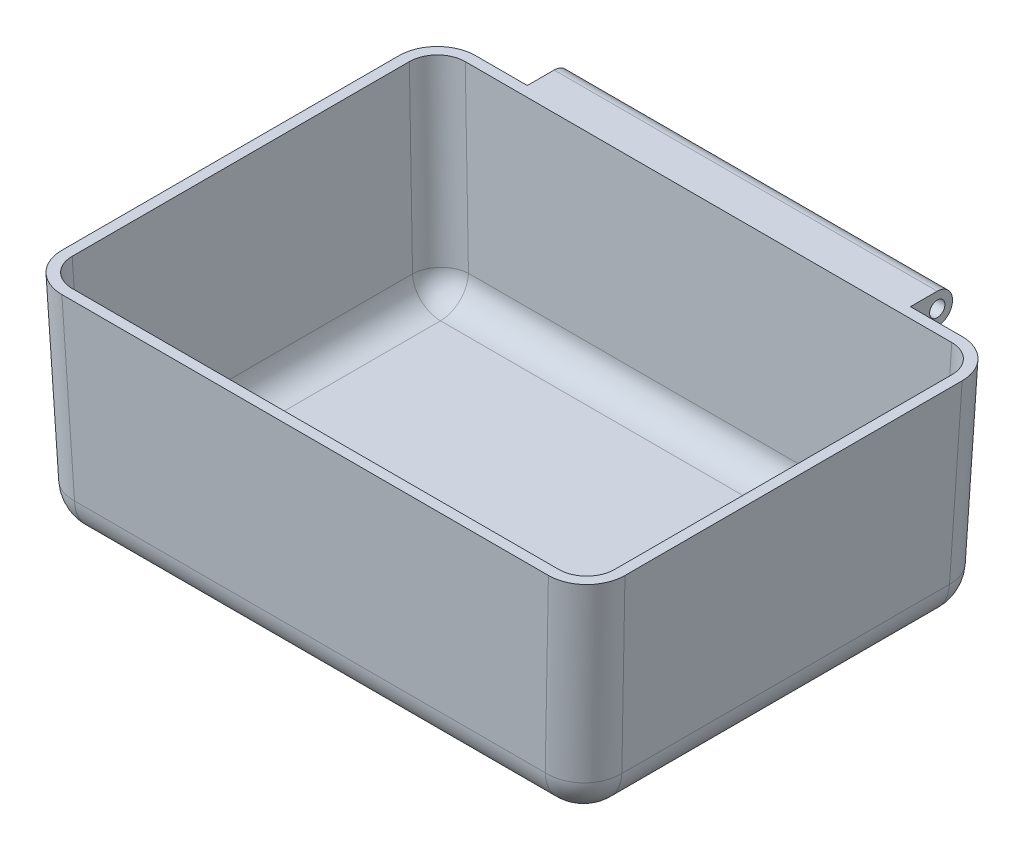
ISO-10303-21;
HEADER;
FILE_DESCRIPTION(('STEP AP214'),'2;1');
FILE_NAME('part.step','',(''),(''),'','','');
FILE_SCHEMA(('AUTOMOTIVE_DESIGN { 1 0 10303 214 1 1 1 1 }'));
ENDSEC;
DATA;
#1=APPLICATION_CONTEXT('core data for automotive mechanical design processes');
#2=APPLICATION_PROTOCOL_DEFINITION('international standard','automotive_design',2000,#1);
#3=PRODUCT_CONTEXT('',#1,'mechanical');
#4=PRODUCT('Part','Part','',(#3));
#5=PRODUCT_RELATED_PRODUCT_CATEGORY('part','',(#4));
#6=PRODUCT_DEFINITION_FORMATION('','',#4);
#7=PRODUCT_DEFINITION_CONTEXT('part definition',#1,'design');
#8=PRODUCT_DEFINITION('design','',#6,#7);
#9=PRODUCT_DEFINITION_SHAPE('','',#8);
#10=(LENGTH_UNIT() NAMED_UNIT(*) SI_UNIT(.MILLI.,.METRE.));
#11=(NAMED_UNIT(*) PLANE_ANGLE_UNIT() SI_UNIT($,.RADIAN.));
#12=(NAMED_UNIT(*) SI_UNIT($,.STERADIAN.) SOLID_ANGLE_UNIT());
#13=UNCERTAINTY_MEASURE_WITH_UNIT(LENGTH_MEASURE(1.E-05),#10,'distance_accuracy_value','');
#14=(GEOMETRIC_REPRESENTATION_CONTEXT(3) GLOBAL_UNCERTAINTY_ASSIGNED_CONTEXT((#13)) GLOBAL_UNIT_ASSIGNED_CONTEXT((#10,
#11,#12)) REPRESENTATION_CONTEXT('',''));
#15=CARTESIAN_POINT('',(0.,0.,0.));
#16=DIRECTION('',(0.,0.,1.));
#17=DIRECTION('',(1.,0.,0.));
#18=AXIS2_PLACEMENT_3D('',#15,#16,#17);
#19=CARTESIAN_POINT('',(0.,0.,0.));
#20=DIRECTION('',(0.,1.,0.));
#21=DIRECTION('',(0.,0.,1.));
#22=AXIS2_PLACEMENT_3D('',#19,#20,#21);
#23=PLANE('',#22);
#24=DIRECTION('',(0.,0.,1.));
#25=VECTOR('',#24,1.);
#26=CARTESIAN_POINT('',(-61.4364686080028,0.,-52.5));
#27=LINE('',#26,#25);
#28=CARTESIAN_POINT('',(-61.4364686080028,0.,42.7642704136395));
#29=VERTEX_POINT('',#28);
#30=CARTESIAN_POINT('',(-61.4364686080028,0.,-42.7642704136395));
#31=VERTEX_POINT('',#30);
#32=EDGE_CURVE('E477',#29,#31,#27,.F.);
#33=ORIENTED_EDGE('',*,*,#32,.T.);
#34=DIRECTION('',(-1.,0.,0.));
#35=VECTOR('',#34,1.);
#36=CARTESIAN_POINT('',(71.,0.,-42.7642704136395));
#37=LINE('',#36,#35);
#38=CARTESIAN_POINT('',(61.4364686080027,0.,-42.7642704136395));
#39=VERTEX_POINT('',#38);
#40=EDGE_CURVE('E443',#31,#39,#37,.F.);
#41=ORIENTED_EDGE('',*,*,#40,.T.);
#42=DIRECTION('',(0.,0.,-1.));
#43=VECTOR('',#42,1.);
#44=CARTESIAN_POINT('',(61.4364686080027,0.,52.5));
#45=LINE('',#44,#43);
#46=CARTESIAN_POINT('',(61.4364686080027,0.,42.7642704136395));
#47=VERTEX_POINT('',#46);
#48=EDGE_CURVE('E543',#39,#47,#45,.F.);
#49=ORIENTED_EDGE('',*,*,#48,.T.);
#50=DIRECTION('',(1.,0.,0.));
#51=VECTOR('',#50,1.);
#52=CARTESIAN_POINT('',(-71.,0.,42.7642704136395));
#53=LINE('',#52,#51);
#54=EDGE_CURVE('E547',#47,#29,#53,.F.);
#55=ORIENTED_EDGE('',*,*,#54,.T.);
#56=EDGE_LOOP('',(#33,#41,#49,#55));
#57=FACE_BOUND('',#56,.T.);
#58=ADVANCED_FACE('F48',(#57),#23,.F.);
#59=CARTESIAN_POINT('',(0.,56.,0.));
#60=DIRECTION('',(0.,1.,0.));
#61=DIRECTION('',(0.,0.,1.));
#62=AXIS2_PLACEMENT_3D('',#59,#60,#61);
#63=PLANE('',#62);
#64=DIRECTION('',(0.,0.,1.));
#65=VECTOR('',#64,1.);
#66=CARTESIAN_POINT('',(-70.7973108098751,56.,0.));
#67=LINE('',#66,#65);
#68=CARTESIAN_POINT('',(-70.7973108098751,56.,-44.0051338580685));
#69=VERTEX_POINT('',#68);
#70=CARTESIAN_POINT('',(-70.7973108098751,56.,44.0051338580685));
#71=VERTEX_POINT('',#70);
#72=EDGE_CURVE('E318',#69,#71,#67,.T.);
#73=ORIENTED_EDGE('',*,*,#72,.F.);
#74=CARTESIAN_POINT('',(-63.4900400365742,56.,-43.9964132707823));
#75=DIRECTION('',(0.,1.,0.));
#76=DIRECTION('',(0.857492925712545,0.,0.514495755427525));
#77=AXIS2_PLACEMENT_3D('',#74,#75,#76);
#78=ELLIPSE('',#77,7.30988648132773,7.3);
#79=CARTESIAN_POINT('',(-63.4987661797022,56.,-51.2990315831112));
#80=VERTEX_POINT('',#79);
#81=EDGE_CURVE('E324',#80,#69,#78,.T.);
#82=ORIENTED_EDGE('',*,*,#81,.F.);
#83=DIRECTION('',(-1.,0.,0.));
#84=VECTOR('',#83,1.);
#85=CARTESIAN_POINT('',(0.,56.,-51.2990315831112));
#86=LINE('',#85,#84);
#87=CARTESIAN_POINT('',(63.4987661797021,56.,-51.2990315831112));
#88=VERTEX_POINT('',#87);
#89=EDGE_CURVE('E74',#88,#80,#86,.T.);
#90=ORIENTED_EDGE('',*,*,#89,.F.);
#91=CARTESIAN_POINT('',(63.4900400365742,56.,-43.9964132707823));
#92=DIRECTION('',(0.,1.,0.));
#93=DIRECTION('',(-0.857492925712548,0.,0.514495755427521));
#94=AXIS2_PLACEMENT_3D('',#91,#92,#93);
#95=ELLIPSE('',#94,7.30988648132773,7.3);
#96=CARTESIAN_POINT('',(70.797310809875,56.,-44.0051338580685));
#97=VERTEX_POINT('',#96);
#98=EDGE_CURVE('E320',#97,#88,#95,.T.);
#99=ORIENTED_EDGE('',*,*,#98,.F.);
#100=DIRECTION('',(0.,0.,-1.));
#101=VECTOR('',#100,1.);
#102=CARTESIAN_POINT('',(70.797310809875,56.,0.));
#103=LINE('',#102,#101);
#104=CARTESIAN_POINT('',(70.797310809875,56.,44.0051338580685));
#105=VERTEX_POINT('',#104);
#106=EDGE_CURVE('E259',#105,#97,#103,.T.);
#107=ORIENTED_EDGE('',*,*,#106,.F.);
#108=CARTESIAN_POINT('',(63.4900400365742,56.,43.9964132707824));
#109=DIRECTION('',(0.,1.,0.));
#110=DIRECTION('',(-0.857492925712546,0.,-0.514495755427524));
#111=AXIS2_PLACEMENT_3D('',#108,#109,#110);
#112=ELLIPSE('',#111,7.30988648132773,7.3);
#113=CARTESIAN_POINT('',(63.4987661797021,56.,51.2990315831113));
#114=VERTEX_POINT('',#113);
#115=EDGE_CURVE('E281',#114,#105,#112,.T.);
#116=ORIENTED_EDGE('',*,*,#115,.F.);
#117=DIRECTION('',(1.,0.,0.));
#118=VECTOR('',#117,1.);
#119=CARTESIAN_POINT('',(0.,56.,51.2990315831113));
#120=LINE('',#119,#118);
#121=CARTESIAN_POINT('',(-63.4987661797021,56.,51.2990315831113));
#122=VERTEX_POINT('',#121);
#123=EDGE_CURVE('E315',#122,#114,#120,.T.);
#124=ORIENTED_EDGE('',*,*,#123,.F.);
#125=CARTESIAN_POINT('',(-63.4900400365742,56.,43.9964132707824));
#126=DIRECTION('',(0.,1.,0.));
#127=DIRECTION('',(0.857492925712543,0.,-0.514495755427528));
#128=AXIS2_PLACEMENT_3D('',#125,#126,#127);
#129=ELLIPSE('',#128,7.30988648132773,7.3);
#130=EDGE_CURVE('E327',#71,#122,#129,.T.);
#131=ORIENTED_EDGE('',*,*,#130,.F.);
#132=EDGE_LOOP('',(#73,#82,#90,#99,#107,#116,#124,#131));
#133=FACE_BOUND('',#132,.T.);
#134=DIRECTION('',(0.,0.,1.));
#135=VECTOR('',#134,1.);
#136=CARTESIAN_POINT('',(-73.5,56.,-54.));
#137=LINE('',#136,#135);
#138=CARTESIAN_POINT('',(-73.5,56.,-44.0083592807634));
#139=VERTEX_POINT('',#138);
#140=CARTESIAN_POINT('',(-73.5,56.,44.0083592807634));
#141=VERTEX_POINT('',#140);
#142=EDGE_CURVE('E441',#139,#141,#137,.T.);
#143=ORIENTED_EDGE('',*,*,#142,.T.);
#144=CARTESIAN_POINT('',(-63.4900400365742,56.,43.9964132707824));
#145=DIRECTION('',(0.,1.,0.));
#146=DIRECTION('',(0.857492925712543,0.,-0.514495755427528));
#147=AXIS2_PLACEMENT_3D('',#144,#145,#146);
#148=ELLIPSE('',#147,10.0135431251065,10.);
#149=CARTESIAN_POINT('',(-63.5019936572974,56.,54.));
#150=VERTEX_POINT('',#149);
#151=EDGE_CURVE('E12',#141,#150,#148,.T.);
#152=ORIENTED_EDGE('',*,*,#151,.T.);
#153=DIRECTION('',(1.,0.,0.));
#154=VECTOR('',#153,1.);
#155=CARTESIAN_POINT('',(-73.5,56.,54.));
#156=LINE('',#155,#154);
#157=CARTESIAN_POINT('',(63.5019936572974,56.,54.));
#158=VERTEX_POINT('',#157);
#159=EDGE_CURVE('E376',#150,#158,#156,.T.);
#160=ORIENTED_EDGE('',*,*,#159,.T.);
#161=CARTESIAN_POINT('',(63.4900400365742,56.,43.9964132707824));
#162=DIRECTION('',(0.,1.,0.));
#163=DIRECTION('',(-0.857492925712546,0.,-0.514495755427524));
#164=AXIS2_PLACEMENT_3D('',#161,#162,#163);
#165=ELLIPSE('',#164,10.0135431251065,10.);
#166=CARTESIAN_POINT('',(73.5,56.,44.0083592807634));
#167=VERTEX_POINT('',#166);
#168=EDGE_CURVE('E578',#158,#167,#165,.T.);
#169=ORIENTED_EDGE('',*,*,#168,.T.);
#170=DIRECTION('',(0.,0.,-1.));
#171=VECTOR('',#170,1.);
#172=CARTESIAN_POINT('',(73.5,56.,-54.));
#173=LINE('',#172,#171);
#174=CARTESIAN_POINT('',(73.5,56.,-44.0083592807634));
#175=VERTEX_POINT('',#174);
#176=EDGE_CURVE('E397',#167,#175,#173,.T.);
#177=ORIENTED_EDGE('',*,*,#176,.T.);
#178=CARTESIAN_POINT('',(63.4900400365742,56.,-43.9964132707823));
#179=DIRECTION('',(0.,1.,0.));
#180=DIRECTION('',(-0.857492925712548,0.,0.514495755427521));
#181=AXIS2_PLACEMENT_3D('',#178,#179,#180);
#182=ELLIPSE('',#181,10.0135431251065,10.);
#183=CARTESIAN_POINT('',(63.5019936572974,56.,-54.));
#184=VERTEX_POINT('',#183);
#185=EDGE_CURVE('E525',#175,#184,#182,.T.);
#186=ORIENTED_EDGE('',*,*,#185,.T.);
#187=DIRECTION('',(-1.,0.,0.));
#188=VECTOR('',#187,1.);
#189=CARTESIAN_POINT('',(-73.5,56.,-54.));
#190=LINE('',#189,#188);
#191=CARTESIAN_POINT('',(50.,56.,-54.));
#192=VERTEX_POINT('',#191);
#193=EDGE_CURVE('E502',#184,#192,#190,.T.);
#194=ORIENTED_EDGE('',*,*,#193,.T.);
#195=DIRECTION('',(0.,0.,1.));
#196=VECTOR('',#195,1.);
#197=CARTESIAN_POINT('',(50.,56.,-54.));
#198=LINE('',#197,#196);
#199=CARTESIAN_POINT('',(50.,56.,-61.));
#200=VERTEX_POINT('',#199);
#201=EDGE_CURVE('E66',#200,#192,#198,.T.);
#202=ORIENTED_EDGE('',*,*,#201,.F.);
#203=DIRECTION('',(1.,0.,0.));
#204=VECTOR('',#203,1.);
#205=CARTESIAN_POINT('',(-50.,56.,-61.));
#206=LINE('',#205,#204);
#207=CARTESIAN_POINT('',(-50.,56.,-61.));
#208=VERTEX_POINT('',#207);
#209=EDGE_CURVE('E238',#208,#200,#206,.T.);
#210=ORIENTED_EDGE('',*,*,#209,.F.);
#211=DIRECTION('',(0.,0.,1.));
#212=VECTOR('',#211,1.);
#213=CARTESIAN_POINT('',(-50.,56.,-54.));
#214=LINE('',#213,#212);
#215=CARTESIAN_POINT('',(-50.,56.,-54.));
#216=VERTEX_POINT('',#215);
#217=EDGE_CURVE('E236',#208,#216,#214,.T.);
#218=ORIENTED_EDGE('',*,*,#217,.T.);
#219=CARTESIAN_POINT('',(-63.5019936572974,56.,-54.));
#220=VERTEX_POINT('',#219);
#221=EDGE_CURVE('E52',#216,#220,#190,.T.);
#222=ORIENTED_EDGE('',*,*,#221,.T.);
#223=CARTESIAN_POINT('',(-63.4900400365742,56.,-43.9964132707823));
#224=DIRECTION('',(0.,1.,0.));
#225=DIRECTION('',(0.857492925712545,0.,0.514495755427525));
#226=AXIS2_PLACEMENT_3D('',#223,#224,#225);
#227=ELLIPSE('',#226,10.0135431251065,10.);
#228=EDGE_CURVE('E58',#220,#139,#227,.T.);
#229=ORIENTED_EDGE('',*,*,#228,.T.);
#230=EDGE_LOOP('',(#143,#152,#160,#169,#177,#186,#194,#202,#210,#218,#222,#229));
#231=FACE_BOUND('',#230,.T.);
#232=ADVANCED_FACE('F407',(#133,#231),#63,.T.);
#233=CARTESIAN_POINT('',(70.858779536956,-3.16333837218557,0.));
#234=DIRECTION('',(0.999004994679079,-0.0445984372624594,0.));
#235=DIRECTION('',(0.0445984372624594,0.999004994679079,0.));
#236=AXIS2_PLACEMENT_3D('',#233,#234,#235);
#237=PLANE('',#236);
#238=DIRECTION('',(0.,0.,-1.));
#239=VECTOR('',#238,1.);
#240=CARTESIAN_POINT('',(71.4265185547935,9.55401562737541,-52.5));
#241=LINE('',#240,#239);
#242=CARTESIAN_POINT('',(71.4265185547935,9.55401562737541,42.7642704136395));
#243=VERTEX_POINT('',#242);
#244=CARTESIAN_POINT('',(71.4265185547935,9.55401562737541,-42.7642704136395));
#245=VERTEX_POINT('',#244);
#246=EDGE_CURVE('E592',#243,#245,#241,.T.);
#247=ORIENTED_EDGE('',*,*,#246,.T.);
#248=DIRECTION('',(-0.0445824785344228,-0.998647519171059,0.0267494871206533));
#249=VECTOR('',#248,1.);
#250=CARTESIAN_POINT('',(70.8081868827149,-4.29661382718531,-42.3932714103923));
#251=LINE('',#250,#249);
#252=EDGE_CURVE('E588',#245,#175,#251,.F.);
#253=ORIENTED_EDGE('',*,*,#252,.T.);
#254=ORIENTED_EDGE('',*,*,#176,.F.);
#255=DIRECTION('',(-0.0445824785344228,-0.998647519171059,-0.0267494871206535));
#256=VECTOR('',#255,1.);
#257=CARTESIAN_POINT('',(70.8081868827149,-4.29661382718533,42.3932714103923));
#258=LINE('',#257,#256);
#259=EDGE_CURVE('E389',#167,#243,#258,.T.);
#260=ORIENTED_EDGE('',*,*,#259,.T.);
#261=EDGE_LOOP('',(#247,#253,#254,#260));
#262=FACE_BOUND('',#261,.T.);
#263=ADVANCED_FACE('F351',(#262),#237,.T.);
#264=CARTESIAN_POINT('',(0.,-1.40524177487453,-52.4623595953159));
#265=DIRECTION('',(0.,-0.0267761104199563,-0.999641455678374));
#266=DIRECTION('',(0.,0.999641455678374,-0.0267761104199563));
#267=AXIS2_PLACEMENT_3D('',#264,#265,#266);
#268=PLANE('',#267);
#269=DIRECTION('',(0.,-0.999641455678374,0.0267761104199566));
#270=VECTOR('',#269,1.);
#271=CARTESIAN_POINT('',(-50.,56.,-54.));
#272=LINE('',#271,#270);
#273=CARTESIAN_POINT('',(-50.,48.,-53.7857142857143));
#274=VERTEX_POINT('',#273);
#275=EDGE_CURVE('E235',#216,#274,#272,.T.);
#276=ORIENTED_EDGE('',*,*,#275,.T.);
#277=DIRECTION('',(1.,0.,0.));
#278=VECTOR('',#277,1.);
#279=CARTESIAN_POINT('',(-50.,48.,-53.7857142857143));
#280=LINE('',#279,#278);
#281=CARTESIAN_POINT('',(50.,48.,-53.7857142857143));
#282=VERTEX_POINT('',#281);
#283=EDGE_CURVE('E218',#274,#282,#280,.T.);
#284=ORIENTED_EDGE('',*,*,#283,.T.);
#285=DIRECTION('',(0.,-0.999641455678374,0.0267761104199566));
#286=VECTOR('',#285,1.);
#287=CARTESIAN_POINT('',(50.,56.,-54.));
#288=LINE('',#287,#286);
#289=EDGE_CURVE('E223',#192,#282,#288,.T.);
#290=ORIENTED_EDGE('',*,*,#289,.F.);
#291=ORIENTED_EDGE('',*,*,#193,.F.);
#292=DIRECTION('',(-0.0445824785344228,-0.998647519171059,0.0267494871206533));
#293=VECTOR('',#292,1.);
#294=CARTESIAN_POINT('',(60.8181369359241,-4.11839055876028,-52.3896859671761));
#295=LINE('',#294,#293);
#296=CARTESIAN_POINT('',(61.4364686080027,9.73223889580044,-52.7606849704232));
#297=VERTEX_POINT('',#296);
#298=EDGE_CURVE('E505',#184,#297,#295,.T.);
#299=ORIENTED_EDGE('',*,*,#298,.T.);
#300=DIRECTION('',(-1.,0.,0.));
#301=VECTOR('',#300,1.);
#302=CARTESIAN_POINT('',(-71.,9.73223889580044,-52.7606849704232));
#303=LINE('',#302,#301);
#304=CARTESIAN_POINT('',(-61.4364686080028,9.73223889580044,-52.7606849704232));
#305=VERTEX_POINT('',#304);
#306=EDGE_CURVE('E535',#297,#305,#303,.T.);
#307=ORIENTED_EDGE('',*,*,#306,.T.);
#308=DIRECTION('',(0.0445824785344223,-0.998647519171059,0.0267494871206533));
#309=VECTOR('',#308,1.);
#310=CARTESIAN_POINT('',(-60.8181369359242,-4.11839055876026,-52.3896859671761));
#311=LINE('',#310,#309);
#312=EDGE_CURVE('E536',#305,#220,#311,.F.);
#313=ORIENTED_EDGE('',*,*,#312,.T.);
#314=ORIENTED_EDGE('',*,*,#221,.F.);
#315=EDGE_LOOP('',(#276,#284,#290,#291,#299,#307,#313,#314));
#316=FACE_BOUND('',#315,.T.);
#317=ADVANCED_FACE('F233',(#316),#268,.T.);
#318=CARTESIAN_POINT('',(0.,-1.40524177487454,52.4623595953159));
#319=DIRECTION('',(0.,-0.0267761104199566,0.999641455678374));
#320=DIRECTION('',(0.,-0.999641455678374,-0.0267761104199566));
#321=AXIS2_PLACEMENT_3D('',#318,#319,#320);
#322=PLANE('',#321);
#323=ORIENTED_EDGE('',*,*,#159,.F.);
#324=DIRECTION('',(0.0445824785344223,-0.998647519171059,-0.0267494871206535));
#325=VECTOR('',#324,1.);
#326=CARTESIAN_POINT('',(-60.8181369359242,-4.11839055876027,52.3896859671761));
#327=LINE('',#326,#325);
#328=CARTESIAN_POINT('',(-61.4364686080028,9.73223889580044,52.7606849704232));
#329=VERTEX_POINT('',#328);
#330=EDGE_CURVE('E387',#150,#329,#327,.T.);
#331=ORIENTED_EDGE('',*,*,#330,.T.);
#332=DIRECTION('',(1.,0.,0.));
#333=VECTOR('',#332,1.);
#334=CARTESIAN_POINT('',(71.,9.73223889580044,52.7606849704232));
#335=LINE('',#334,#333);
#336=CARTESIAN_POINT('',(61.4364686080027,9.73223889580044,52.7606849704232));
#337=VERTEX_POINT('',#336);
#338=EDGE_CURVE('E382',#329,#337,#335,.T.);
#339=ORIENTED_EDGE('',*,*,#338,.T.);
#340=DIRECTION('',(-0.0445824785344228,-0.998647519171059,-0.0267494871206535));
#341=VECTOR('',#340,1.);
#342=CARTESIAN_POINT('',(60.8181369359241,-4.1183905587603,52.3896859671761));
#343=LINE('',#342,#341);
#344=EDGE_CURVE('E380',#337,#158,#343,.F.);
#345=ORIENTED_EDGE('',*,*,#344,.T.);
#346=EDGE_LOOP('',(#323,#331,#339,#345));
#347=FACE_BOUND('',#346,.T.);
#348=ADVANCED_FACE('F350',(#347),#322,.T.);
#349=CARTESIAN_POINT('',(-70.858779536956,-3.16333837218554,0.));
#350=DIRECTION('',(-0.999004994679079,-0.0445984372624589,0.));
#351=DIRECTION('',(0.0445984372624589,-0.999004994679079,0.));
#352=AXIS2_PLACEMENT_3D('',#349,#350,#351);
#353=PLANE('',#352);
#354=DIRECTION('',(0.,0.,1.));
#355=VECTOR('',#354,1.);
#356=CARTESIAN_POINT('',(-71.4265185547936,9.55401562737541,52.5));
#357=LINE('',#356,#355);
#358=CARTESIAN_POINT('',(-71.4265185547936,9.55401562737541,-42.7642704136395));
#359=VERTEX_POINT('',#358);
#360=CARTESIAN_POINT('',(-71.4265185547936,9.55401562737541,42.7642704136395));
#361=VERTEX_POINT('',#360);
#362=EDGE_CURVE('E450',#359,#361,#357,.T.);
#363=ORIENTED_EDGE('',*,*,#362,.T.);
#364=DIRECTION('',(0.0445824785344223,-0.998647519171059,-0.0267494871206535));
#365=VECTOR('',#364,1.);
#366=CARTESIAN_POINT('',(-70.808186882715,-4.29661382718529,42.3932714103923));
#367=LINE('',#366,#365);
#368=EDGE_CURVE('E383',#361,#141,#367,.F.);
#369=ORIENTED_EDGE('',*,*,#368,.T.);
#370=ORIENTED_EDGE('',*,*,#142,.F.);
#371=DIRECTION('',(0.0445824785344223,-0.998647519171059,0.0267494871206533));
#372=VECTOR('',#371,1.);
#373=CARTESIAN_POINT('',(-70.808186882715,-4.29661382718528,-42.3932714103923));
#374=LINE('',#373,#372);
#375=EDGE_CURVE('E448',#139,#359,#374,.T.);
#376=ORIENTED_EDGE('',*,*,#375,.T.);
#377=EDGE_LOOP('',(#363,#369,#370,#376));
#378=FACE_BOUND('',#377,.T.);
#379=ADVANCED_FACE('F357',(#378),#353,.T.);
#380=CARTESIAN_POINT('',(60.8181369359241,-3.85062945456073,42.3932714103923));
#381=DIRECTION('',(-0.0445824785344228,-0.998647519171059,-0.0267494871206535));
#382=DIRECTION('',(0.999004994679079,-0.0445984372624594,0.));
#383=AXIS2_PLACEMENT_3D('',#380,#381,#382);
#384=CYLINDRICAL_SURFACE('',#383,10.);
#385=ORIENTED_EDGE('',*,*,#168,.F.);
#386=ORIENTED_EDGE('',*,*,#344,.F.);
#387=CARTESIAN_POINT('',(61.4364686080027,10.,42.7642704136395));
#388=DIRECTION('',(-0.0445824785344228,-0.998647519171059,-0.0267494871206535));
#389=DIRECTION('',(0.999004994679079,-0.0445984372624594,0.));
#390=AXIS2_PLACEMENT_3D('',#387,#388,#389);
#391=CIRCLE('',#390,10.);
#392=EDGE_CURVE('E471',#243,#337,#391,.T.);
#393=ORIENTED_EDGE('',*,*,#392,.F.);
#394=ORIENTED_EDGE('',*,*,#259,.F.);
#395=EDGE_LOOP('',(#385,#386,#393,#394));
#396=FACE_BOUND('',#395,.T.);
#397=ADVANCED_FACE('F50',(#396),#384,.T.);
#398=CARTESIAN_POINT('',(-60.8181369359242,-3.8506294545607,42.3932714103923));
#399=DIRECTION('',(0.0445824785344223,-0.998647519171059,-0.0267494871206535));
#400=DIRECTION('',(0.999004994679079,0.0445984372624589,0.));
#401=AXIS2_PLACEMENT_3D('',#398,#399,#400);
#402=CYLINDRICAL_SURFACE('',#401,10.);
#403=ORIENTED_EDGE('',*,*,#151,.F.);
#404=ORIENTED_EDGE('',*,*,#368,.F.);
#405=CARTESIAN_POINT('',(-61.4364686080028,10.,42.7642704136395));
#406=DIRECTION('',(0.0445824785344223,-0.998647519171059,-0.0267494871206535));
#407=DIRECTION('',(0.999004994679079,0.0445984372624589,0.));
#408=AXIS2_PLACEMENT_3D('',#405,#406,#407);
#409=CIRCLE('',#408,10.);
#410=EDGE_CURVE('E461',#329,#361,#409,.T.);
#411=ORIENTED_EDGE('',*,*,#410,.F.);
#412=ORIENTED_EDGE('',*,*,#330,.F.);
#413=EDGE_LOOP('',(#403,#404,#411,#412));
#414=FACE_BOUND('',#413,.T.);
#415=ADVANCED_FACE('F460',(#414),#402,.T.);
#416=CARTESIAN_POINT('',(0.,10.,42.7642704136395));
#417=DIRECTION('',(-1.,0.,0.));
#418=DIRECTION('',(0.,0.,1.));
#419=AXIS2_PLACEMENT_3D('',#416,#417,#418);
#420=CYLINDRICAL_SURFACE('',#419,10.);
#421=CARTESIAN_POINT('',(61.4364686080027,10.,42.7642704136395));
#422=DIRECTION('',(1.,0.,0.));
#423=DIRECTION('',(0.,1.,0.));
#424=AXIS2_PLACEMENT_3D('',#421,#422,#423);
#425=CIRCLE('',#424,10.);
#426=EDGE_CURVE('E491',#337,#47,#425,.T.);
#427=ORIENTED_EDGE('',*,*,#426,.F.);
#428=ORIENTED_EDGE('',*,*,#338,.F.);
#429=CARTESIAN_POINT('',(-61.4364686080028,10.,42.7642704136395));
#430=DIRECTION('',(-1.,0.,0.));
#431=DIRECTION('',(0.,0.,1.));
#432=AXIS2_PLACEMENT_3D('',#429,#430,#431);
#433=CIRCLE('',#432,10.);
#434=EDGE_CURVE('E470',#29,#329,#433,.T.);
#435=ORIENTED_EDGE('',*,*,#434,.F.);
#436=ORIENTED_EDGE('',*,*,#54,.F.);
#437=EDGE_LOOP('',(#427,#428,#435,#436));
#438=FACE_BOUND('',#437,.T.);
#439=ADVANCED_FACE('F900',(#438),#420,.T.);
#440=CARTESIAN_POINT('',(61.4364686080027,10.,42.7642704136395));
#441=DIRECTION('',(0.,-1.,0.));
#442=DIRECTION('',(0.,0.,-1.));
#443=AXIS2_PLACEMENT_3D('',#440,#441,#442);
#444=SPHERICAL_SURFACE('',#443,10.);
#445=ORIENTED_EDGE('',*,*,#392,.T.);
#446=ORIENTED_EDGE('',*,*,#426,.T.);
#447=CARTESIAN_POINT('',(61.4364686080027,10.,42.7642704136395));
#448=DIRECTION('',(0.,0.,1.));
#449=DIRECTION('',(1.,0.,0.));
#450=AXIS2_PLACEMENT_3D('',#447,#448,#449);
#451=CIRCLE('',#450,10.);
#452=EDGE_CURVE('E478',#243,#47,#451,.F.);
#453=ORIENTED_EDGE('',*,*,#452,.F.);
#454=EDGE_LOOP('',(#445,#446,#453));
#455=FACE_BOUND('',#454,.T.);
#456=ADVANCED_FACE('F605',(#455),#444,.T.);
#457=CARTESIAN_POINT('',(-61.4364686080028,10.,42.7642704136395));
#458=DIRECTION('',(0.,-1.,0.));
#459=DIRECTION('',(0.,0.,-1.));
#460=AXIS2_PLACEMENT_3D('',#457,#458,#459);
#461=SPHERICAL_SURFACE('',#460,10.);
#462=ORIENTED_EDGE('',*,*,#434,.T.);
#463=ORIENTED_EDGE('',*,*,#410,.T.);
#464=CARTESIAN_POINT('',(-61.4364686080028,10.,42.7642704136395));
#465=DIRECTION('',(0.,0.,1.));
#466=DIRECTION('',(1.,0.,0.));
#467=AXIS2_PLACEMENT_3D('',#464,#465,#466);
#468=CIRCLE('',#467,10.);
#469=EDGE_CURVE('E467',#29,#361,#468,.F.);
#470=ORIENTED_EDGE('',*,*,#469,.F.);
#471=EDGE_LOOP('',(#462,#463,#470));
#472=FACE_BOUND('',#471,.T.);
#473=ADVANCED_FACE('F466',(#472),#461,.T.);
#474=CARTESIAN_POINT('',(61.4364686080027,10.,0.));
#475=DIRECTION('',(0.,0.,1.));
#476=DIRECTION('',(1.,0.,0.));
#477=AXIS2_PLACEMENT_3D('',#474,#475,#476);
#478=CYLINDRICAL_SURFACE('',#477,10.);
#479=ORIENTED_EDGE('',*,*,#452,.T.);
#480=ORIENTED_EDGE('',*,*,#48,.F.);
#481=CARTESIAN_POINT('',(61.4364686080027,10.,-42.7642704136395));
#482=DIRECTION('',(0.,0.,-1.));
#483=DIRECTION('',(0.,1.,0.));
#484=AXIS2_PLACEMENT_3D('',#481,#482,#483);
#485=CIRCLE('',#484,10.);
#486=EDGE_CURVE('E479',#245,#39,#485,.T.);
#487=ORIENTED_EDGE('',*,*,#486,.F.);
#488=ORIENTED_EDGE('',*,*,#246,.F.);
#489=EDGE_LOOP('',(#479,#480,#487,#488));
#490=FACE_BOUND('',#489,.T.);
#491=ADVANCED_FACE('F607',(#490),#478,.T.);
#492=CARTESIAN_POINT('',(60.8181369359241,-3.85062945456072,-42.3932714103923));
#493=DIRECTION('',(-0.0445824785344228,-0.998647519171059,0.0267494871206533));
#494=DIRECTION('',(0.999004994679079,-0.0445984372624594,0.));
#495=AXIS2_PLACEMENT_3D('',#492,#493,#494);
#496=CYLINDRICAL_SURFACE('',#495,10.);
#497=ORIENTED_EDGE('',*,*,#185,.F.);
#498=ORIENTED_EDGE('',*,*,#252,.F.);
#499=CARTESIAN_POINT('',(61.4364686080027,10.,-42.7642704136395));
#500=DIRECTION('',(-0.0445824785344228,-0.998647519171059,0.0267494871206533));
#501=DIRECTION('',(0.999004994679079,-0.0445984372624595,0.));
#502=AXIS2_PLACEMENT_3D('',#499,#500,#501);
#503=CIRCLE('',#502,10.);
#504=EDGE_CURVE('E484',#297,#245,#503,.T.);
#505=ORIENTED_EDGE('',*,*,#504,.F.);
#506=ORIENTED_EDGE('',*,*,#298,.F.);
#507=EDGE_LOOP('',(#497,#498,#505,#506));
#508=FACE_BOUND('',#507,.T.);
#509=ADVANCED_FACE('F531',(#508),#496,.T.);
#510=CARTESIAN_POINT('',(-60.8181369359242,-3.85062945456069,-42.3932714103923));
#511=DIRECTION('',(0.0445824785344223,-0.998647519171059,0.0267494871206533));
#512=DIRECTION('',(0.999004994679079,0.0445984372624589,0.));
#513=AXIS2_PLACEMENT_3D('',#510,#511,#512);
#514=CYLINDRICAL_SURFACE('',#513,10.);
#515=ORIENTED_EDGE('',*,*,#228,.F.);
#516=ORIENTED_EDGE('',*,*,#312,.F.);
#517=CARTESIAN_POINT('',(-61.4364686080028,10.,-42.7642704136395));
#518=DIRECTION('',(0.0445824785344223,-0.998647519171059,0.0267494871206533));
#519=DIRECTION('',(0.999004994679079,0.0445984372624589,0.));
#520=AXIS2_PLACEMENT_3D('',#517,#518,#519);
#521=CIRCLE('',#520,10.);
#522=EDGE_CURVE('E563',#359,#305,#521,.T.);
#523=ORIENTED_EDGE('',*,*,#522,.F.);
#524=ORIENTED_EDGE('',*,*,#375,.F.);
#525=EDGE_LOOP('',(#515,#516,#523,#524));
#526=FACE_BOUND('',#525,.T.);
#527=ADVANCED_FACE('F576',(#526),#514,.T.);
#528=CARTESIAN_POINT('',(-61.4364686080028,10.,0.));
#529=DIRECTION('',(0.,0.,-1.));
#530=DIRECTION('',(-1.,0.,0.));
#531=AXIS2_PLACEMENT_3D('',#528,#529,#530);
#532=CYLINDRICAL_SURFACE('',#531,10.);
#533=ORIENTED_EDGE('',*,*,#469,.T.);
#534=ORIENTED_EDGE('',*,*,#362,.F.);
#535=CARTESIAN_POINT('',(-61.4364686080028,10.,-42.7642704136395));
#536=DIRECTION('',(0.,0.,-1.));
#537=DIRECTION('',(-1.,0.,0.));
#538=AXIS2_PLACEMENT_3D('',#535,#536,#537);
#539=CIRCLE('',#538,10.);
#540=EDGE_CURVE('E562',#31,#359,#539,.T.);
#541=ORIENTED_EDGE('',*,*,#540,.F.);
#542=ORIENTED_EDGE('',*,*,#32,.F.);
#543=EDGE_LOOP('',(#533,#534,#541,#542));
#544=FACE_BOUND('',#543,.T.);
#545=ADVANCED_FACE('F474',(#544),#532,.T.);
#546=CARTESIAN_POINT('',(61.4364686080027,10.,-42.7642704136395));
#547=DIRECTION('',(0.,-1.,0.));
#548=DIRECTION('',(0.,0.,-1.));
#549=AXIS2_PLACEMENT_3D('',#546,#547,#548);
#550=SPHERICAL_SURFACE('',#549,10.);
#551=ORIENTED_EDGE('',*,*,#504,.T.);
#552=ORIENTED_EDGE('',*,*,#486,.T.);
#553=CARTESIAN_POINT('',(61.4364686080027,10.,-42.7642704136395));
#554=DIRECTION('',(1.,0.,0.));
#555=DIRECTION('',(0.,0.,-1.));
#556=AXIS2_PLACEMENT_3D('',#553,#554,#555);
#557=CIRCLE('',#556,10.);
#558=EDGE_CURVE('E558',#297,#39,#557,.F.);
#559=ORIENTED_EDGE('',*,*,#558,.F.);
#560=EDGE_LOOP('',(#551,#552,#559));
#561=FACE_BOUND('',#560,.T.);
#562=ADVANCED_FACE('F572',(#561),#550,.T.);
#563=CARTESIAN_POINT('',(-61.4364686080028,10.,-42.7642704136395));
#564=DIRECTION('',(0.,-1.,0.));
#565=DIRECTION('',(0.,0.,-1.));
#566=AXIS2_PLACEMENT_3D('',#563,#564,#565);
#567=SPHERICAL_SURFACE('',#566,10.);
#568=ORIENTED_EDGE('',*,*,#540,.T.);
#569=ORIENTED_EDGE('',*,*,#522,.T.);
#570=CARTESIAN_POINT('',(-61.4364686080028,10.,-42.7642704136395));
#571=DIRECTION('',(-1.,0.,0.));
#572=DIRECTION('',(0.,0.,1.));
#573=AXIS2_PLACEMENT_3D('',#570,#571,#572);
#574=CIRCLE('',#573,10.);
#575=EDGE_CURVE('E331',#31,#305,#574,.F.);
#576=ORIENTED_EDGE('',*,*,#575,.F.);
#577=EDGE_LOOP('',(#568,#569,#576));
#578=FACE_BOUND('',#577,.T.);
#579=ADVANCED_FACE('F561',(#578),#567,.T.);
#580=CARTESIAN_POINT('',(0.,10.,-42.7642704136395));
#581=DIRECTION('',(1.,0.,0.));
#582=DIRECTION('',(0.,0.,-1.));
#583=AXIS2_PLACEMENT_3D('',#580,#581,#582);
#584=CYLINDRICAL_SURFACE('',#583,10.);
#585=ORIENTED_EDGE('',*,*,#558,.T.);
#586=ORIENTED_EDGE('',*,*,#40,.F.);
#587=ORIENTED_EDGE('',*,*,#575,.T.);
#588=ORIENTED_EDGE('',*,*,#306,.F.);
#589=EDGE_LOOP('',(#585,#586,#587,#588));
#590=FACE_BOUND('',#589,.T.);
#591=ADVANCED_FACE('F555',(#590),#584,.T.);
#592=CARTESIAN_POINT('',(0.,2.7,0.));
#593=DIRECTION('',(0.,1.,0.));
#594=DIRECTION('',(0.,0.,1.));
#595=AXIS2_PLACEMENT_3D('',#592,#593,#594);
#596=PLANE('',#595);
#597=DIRECTION('',(0.,0.,1.));
#598=VECTOR('',#597,1.);
#599=CARTESIAN_POINT('',(-61.4364686080028,2.7,0.));
#600=LINE('',#599,#598);
#601=CARTESIAN_POINT('',(-61.4364686080028,2.7,42.7642704136395));
#602=VERTEX_POINT('',#601);
#603=CARTESIAN_POINT('',(-61.4364686080028,2.7,-42.7642704136395));
#604=VERTEX_POINT('',#603);
#605=EDGE_CURVE('E245',#602,#604,#600,.F.);
#606=ORIENTED_EDGE('',*,*,#605,.F.);
#607=DIRECTION('',(1.,0.,0.));
#608=VECTOR('',#607,1.);
#609=CARTESIAN_POINT('',(0.,2.7,42.7642704136395));
#610=LINE('',#609,#608);
#611=CARTESIAN_POINT('',(61.4364686080027,2.7,42.7642704136395));
#612=VERTEX_POINT('',#611);
#613=EDGE_CURVE('E248',#612,#602,#610,.F.);
#614=ORIENTED_EDGE('',*,*,#613,.F.);
#615=DIRECTION('',(0.,0.,1.));
#616=VECTOR('',#615,1.);
#617=CARTESIAN_POINT('',(61.4364686080027,2.7,0.));
#618=LINE('',#617,#616);
#619=CARTESIAN_POINT('',(61.4364686080027,2.7,-42.7642704136395));
#620=VERTEX_POINT('',#619);
#621=EDGE_CURVE('E252',#620,#612,#618,.T.);
#622=ORIENTED_EDGE('',*,*,#621,.F.);
#623=DIRECTION('',(1.,0.,0.));
#624=VECTOR('',#623,1.);
#625=CARTESIAN_POINT('',(0.,2.7,-42.7642704136395));
#626=LINE('',#625,#624);
#627=EDGE_CURVE('E247',#604,#620,#626,.T.);
#628=ORIENTED_EDGE('',*,*,#627,.F.);
#629=EDGE_LOOP('',(#606,#614,#622,#628));
#630=FACE_BOUND('',#629,.T.);
#631=ADVANCED_FACE('F622',(#630),#596,.T.);
#632=CARTESIAN_POINT('',(68.1614660513225,-3.04292259157693,0.));
#633=DIRECTION('',(0.999004994679079,-0.0445984372624594,0.));
#634=DIRECTION('',(0.0445984372624594,0.999004994679079,0.));
#635=AXIS2_PLACEMENT_3D('',#632,#633,#634);
#636=PLANE('',#635);
#637=DIRECTION('',(0.,0.,1.));
#638=VECTOR('',#637,1.);
#639=CARTESIAN_POINT('',(68.72920506916,9.67443140798405,0.));
#640=LINE('',#639,#638);
#641=CARTESIAN_POINT('',(68.72920506916,9.67443140798405,42.7642704136395));
#642=VERTEX_POINT('',#641);
#643=CARTESIAN_POINT('',(68.72920506916,9.67443140798405,-42.7642704136395));
#644=VERTEX_POINT('',#643);
#645=EDGE_CURVE('E277',#642,#644,#640,.F.);
#646=ORIENTED_EDGE('',*,*,#645,.F.);
#647=DIRECTION('',(-0.0445824785344228,-0.998647519171059,-0.0267494871206535));
#648=VECTOR('',#647,1.);
#649=CARTESIAN_POINT('',(68.1108733970814,-4.17619804657669,42.3932714103923));
#650=LINE('',#649,#648);
#651=EDGE_CURVE('E271',#105,#642,#650,.T.);
#652=ORIENTED_EDGE('',*,*,#651,.F.);
#653=ORIENTED_EDGE('',*,*,#106,.T.);
#654=DIRECTION('',(-0.0445824785344228,-0.998647519171059,0.0267494871206533));
#655=VECTOR('',#654,1.);
#656=CARTESIAN_POINT('',(68.1108733970814,-4.17619804657667,-42.3932714103923));
#657=LINE('',#656,#655);
#658=EDGE_CURVE('E279',#644,#97,#657,.F.);
#659=ORIENTED_EDGE('',*,*,#658,.F.);
#660=EDGE_LOOP('',(#646,#652,#653,#659));
#661=FACE_BOUND('',#660,.T.);
#662=ADVANCED_FACE('F656',(#661),#636,.F.);
#663=CARTESIAN_POINT('',(0.,-1.33294627674064,-49.7633276649843));
#664=DIRECTION('',(0.,-0.0267761104199563,-0.999641455678374));
#665=DIRECTION('',(0.,0.999641455678374,-0.0267761104199563));
#666=AXIS2_PLACEMENT_3D('',#663,#664,#665);
#667=PLANE('',#666);
#668=DIRECTION('',(1.,0.,0.));
#669=VECTOR('',#668,1.);
#670=CARTESIAN_POINT('',(0.,9.80453439393432,-50.0616530400916));
#671=LINE('',#670,#669);
#672=CARTESIAN_POINT('',(61.4364686080027,9.80453439393432,-50.0616530400916));
#673=VERTEX_POINT('',#672);
#674=CARTESIAN_POINT('',(-61.4364686080028,9.80453439393432,-50.0616530400916));
#675=VERTEX_POINT('',#674);
#676=EDGE_CURVE('E294',#673,#675,#671,.F.);
#677=ORIENTED_EDGE('',*,*,#676,.F.);
#678=DIRECTION('',(-0.0445824785344228,-0.998647519171059,0.0267494871206533));
#679=VECTOR('',#678,1.);
#680=CARTESIAN_POINT('',(60.8181369359241,-4.0460950606264,-49.6906540368445));
#681=LINE('',#680,#679);
#682=EDGE_CURVE('E292',#88,#673,#681,.T.);
#683=ORIENTED_EDGE('',*,*,#682,.F.);
#684=ORIENTED_EDGE('',*,*,#89,.T.);
#685=DIRECTION('',(0.0445824785344223,-0.998647519171059,0.0267494871206533));
#686=VECTOR('',#685,1.);
#687=CARTESIAN_POINT('',(-60.8181369359242,-4.04609506062638,-49.6906540368445));
#688=LINE('',#687,#686);
#689=EDGE_CURVE('E254',#675,#80,#688,.F.);
#690=ORIENTED_EDGE('',*,*,#689,.F.);
#691=EDGE_LOOP('',(#677,#683,#684,#690));
#692=FACE_BOUND('',#691,.T.);
#693=ADVANCED_FACE('F664',(#692),#667,.F.);
#694=CARTESIAN_POINT('',(0.,-1.33294627674066,49.7633276649843));
#695=DIRECTION('',(0.,-0.0267761104199566,0.999641455678374));
#696=DIRECTION('',(0.,-0.999641455678374,-0.0267761104199566));
#697=AXIS2_PLACEMENT_3D('',#694,#695,#696);
#698=PLANE('',#697);
#699=ORIENTED_EDGE('',*,*,#123,.T.);
#700=DIRECTION('',(-0.0445824785344228,-0.998647519171059,-0.0267494871206535));
#701=VECTOR('',#700,1.);
#702=CARTESIAN_POINT('',(60.8181369359241,-4.04609506062642,49.6906540368445));
#703=LINE('',#702,#701);
#704=CARTESIAN_POINT('',(61.4364686080027,9.80453439393432,50.0616530400916));
#705=VERTEX_POINT('',#704);
#706=EDGE_CURVE('E264',#705,#114,#703,.F.);
#707=ORIENTED_EDGE('',*,*,#706,.F.);
#708=DIRECTION('',(1.,0.,0.));
#709=VECTOR('',#708,1.);
#710=CARTESIAN_POINT('',(0.,9.80453439393432,50.0616530400916));
#711=LINE('',#710,#709);
#712=CARTESIAN_POINT('',(-61.4364686080028,9.80453439393432,50.0616530400916));
#713=VERTEX_POINT('',#712);
#714=EDGE_CURVE('E261',#713,#705,#711,.T.);
#715=ORIENTED_EDGE('',*,*,#714,.F.);
#716=DIRECTION('',(0.0445824785344223,-0.998647519171059,-0.0267494871206535));
#717=VECTOR('',#716,1.);
#718=CARTESIAN_POINT('',(-60.8181369359242,-4.04609506062639,49.6906540368445));
#719=LINE('',#718,#717);
#720=EDGE_CURVE('E263',#122,#713,#719,.T.);
#721=ORIENTED_EDGE('',*,*,#720,.F.);
#722=EDGE_LOOP('',(#699,#707,#715,#721));
#723=FACE_BOUND('',#722,.T.);
#724=ADVANCED_FACE('F672',(#723),#698,.F.);
#725=CARTESIAN_POINT('',(-68.1614660513225,-3.0429225915769,0.));
#726=DIRECTION('',(-0.999004994679079,-0.0445984372624589,0.));
#727=DIRECTION('',(0.0445984372624589,-0.999004994679079,0.));
#728=AXIS2_PLACEMENT_3D('',#725,#726,#727);
#729=PLANE('',#728);
#730=DIRECTION('',(0.,0.,1.));
#731=VECTOR('',#730,1.);
#732=CARTESIAN_POINT('',(-68.7292050691601,9.67443140798405,0.));
#733=LINE('',#732,#731);
#734=CARTESIAN_POINT('',(-68.7292050691601,9.67443140798405,-42.7642704136395));
#735=VERTEX_POINT('',#734);
#736=CARTESIAN_POINT('',(-68.7292050691601,9.67443140798405,42.7642704136395));
#737=VERTEX_POINT('',#736);
#738=EDGE_CURVE('E302',#735,#737,#733,.T.);
#739=ORIENTED_EDGE('',*,*,#738,.F.);
#740=DIRECTION('',(0.0445824785344223,-0.998647519171059,0.0267494871206533));
#741=VECTOR('',#740,1.);
#742=CARTESIAN_POINT('',(-68.1108733970815,-4.17619804657664,-42.3932714103923));
#743=LINE('',#742,#741);
#744=EDGE_CURVE('E251',#69,#735,#743,.T.);
#745=ORIENTED_EDGE('',*,*,#744,.F.);
#746=ORIENTED_EDGE('',*,*,#72,.T.);
#747=DIRECTION('',(0.0445824785344223,-0.998647519171059,-0.0267494871206535));
#748=VECTOR('',#747,1.);
#749=CARTESIAN_POINT('',(-68.1108733970814,-4.17619804657665,42.3932714103923));
#750=LINE('',#749,#748);
#751=EDGE_CURVE('E273',#737,#71,#750,.F.);
#752=ORIENTED_EDGE('',*,*,#751,.F.);
#753=EDGE_LOOP('',(#739,#745,#746,#752));
#754=FACE_BOUND('',#753,.T.);
#755=ADVANCED_FACE('F679',(#754),#729,.F.);
#756=CARTESIAN_POINT('',(60.8181369359241,-3.85062945456073,42.3932714103923));
#757=DIRECTION('',(-0.0445824785344228,-0.998647519171059,-0.0267494871206535));
#758=DIRECTION('',(0.999004994679079,-0.0445984372624594,0.));
#759=AXIS2_PLACEMENT_3D('',#756,#757,#758);
#760=CYLINDRICAL_SURFACE('',#759,7.3);
#761=ORIENTED_EDGE('',*,*,#115,.T.);
#762=ORIENTED_EDGE('',*,*,#651,.T.);
#763=CARTESIAN_POINT('',(61.4364686080027,10.,42.7642704136395));
#764=DIRECTION('',(-0.0445824785344228,-0.998647519171059,-0.0267494871206535));
#765=DIRECTION('',(0.999004994679079,-0.0445984372624594,0.));
#766=AXIS2_PLACEMENT_3D('',#763,#764,#765);
#767=CIRCLE('',#766,7.3);
#768=EDGE_CURVE('E260',#642,#705,#767,.T.);
#769=ORIENTED_EDGE('',*,*,#768,.T.);
#770=ORIENTED_EDGE('',*,*,#706,.T.);
#771=EDGE_LOOP('',(#761,#762,#769,#770));
#772=FACE_BOUND('',#771,.T.);
#773=ADVANCED_FACE('F687',(#772),#760,.F.);
#774=CARTESIAN_POINT('',(-60.8181369359242,-3.8506294545607,42.3932714103923));
#775=DIRECTION('',(0.0445824785344223,-0.998647519171059,-0.0267494871206535));
#776=DIRECTION('',(0.999004994679079,0.0445984372624589,0.));
#777=AXIS2_PLACEMENT_3D('',#774,#775,#776);
#778=CYLINDRICAL_SURFACE('',#777,7.3);
#779=ORIENTED_EDGE('',*,*,#130,.T.);
#780=ORIENTED_EDGE('',*,*,#720,.T.);
#781=CARTESIAN_POINT('',(-61.4364686080028,10.,42.7642704136395));
#782=DIRECTION('',(0.0445824785344223,-0.998647519171059,-0.0267494871206535));
#783=DIRECTION('',(0.999004994679079,0.0445984372624589,0.));
#784=AXIS2_PLACEMENT_3D('',#781,#782,#783);
#785=CIRCLE('',#784,7.3);
#786=EDGE_CURVE('E268',#713,#737,#785,.T.);
#787=ORIENTED_EDGE('',*,*,#786,.T.);
#788=ORIENTED_EDGE('',*,*,#751,.T.);
#789=EDGE_LOOP('',(#779,#780,#787,#788));
#790=FACE_BOUND('',#789,.T.);
#791=ADVANCED_FACE('F695',(#790),#778,.F.);
#792=CARTESIAN_POINT('',(0.,10.,42.7642704136395));
#793=DIRECTION('',(-1.,0.,0.));
#794=DIRECTION('',(0.,0.,1.));
#795=AXIS2_PLACEMENT_3D('',#792,#793,#794);
#796=CYLINDRICAL_SURFACE('',#795,7.3);
#797=CARTESIAN_POINT('',(61.4364686080027,10.,42.7642704136395));
#798=DIRECTION('',(1.,0.,0.));
#799=DIRECTION('',(0.,0.,-1.));
#800=AXIS2_PLACEMENT_3D('',#797,#798,#799);
#801=CIRCLE('',#800,7.3);
#802=EDGE_CURVE('E256',#705,#612,#801,.T.);
#803=ORIENTED_EDGE('',*,*,#802,.T.);
#804=ORIENTED_EDGE('',*,*,#613,.T.);
#805=CARTESIAN_POINT('',(-61.4364686080028,10.,42.7642704136395));
#806=DIRECTION('',(1.,0.,0.));
#807=DIRECTION('',(0.,0.,-1.));
#808=AXIS2_PLACEMENT_3D('',#805,#806,#807);
#809=CIRCLE('',#808,7.3);
#810=EDGE_CURVE('E265',#602,#713,#809,.F.);
#811=ORIENTED_EDGE('',*,*,#810,.T.);
#812=ORIENTED_EDGE('',*,*,#714,.T.);
#813=EDGE_LOOP('',(#803,#804,#811,#812));
#814=FACE_BOUND('',#813,.T.);
#815=ADVANCED_FACE('F703',(#814),#796,.F.);
#816=CARTESIAN_POINT('',(61.4364686080027,10.,42.7642704136395));
#817=DIRECTION('',(0.,-1.,0.));
#818=DIRECTION('',(0.,0.,-1.));
#819=AXIS2_PLACEMENT_3D('',#816,#817,#818);
#820=SPHERICAL_SURFACE('',#819,7.3);
#821=ORIENTED_EDGE('',*,*,#768,.F.);
#822=CARTESIAN_POINT('',(61.4364686080027,10.,42.7642704136395));
#823=DIRECTION('',(0.,0.,1.));
#824=DIRECTION('',(1.,0.,0.));
#825=AXIS2_PLACEMENT_3D('',#822,#823,#824);
#826=CIRCLE('',#825,7.3);
#827=EDGE_CURVE('E269',#642,#612,#826,.F.);
#828=ORIENTED_EDGE('',*,*,#827,.T.);
#829=ORIENTED_EDGE('',*,*,#802,.F.);
#830=EDGE_LOOP('',(#821,#828,#829));
#831=FACE_BOUND('',#830,.T.);
#832=ADVANCED_FACE('F711',(#831),#820,.F.);
#833=CARTESIAN_POINT('',(-61.4364686080028,10.,42.7642704136395));
#834=DIRECTION('',(0.,-1.,0.));
#835=DIRECTION('',(0.,0.,-1.));
#836=AXIS2_PLACEMENT_3D('',#833,#834,#835);
#837=SPHERICAL_SURFACE('',#836,7.3);
#838=ORIENTED_EDGE('',*,*,#810,.F.);
#839=CARTESIAN_POINT('',(-61.4364686080028,10.,42.7642704136395));
#840=DIRECTION('',(0.,0.,-1.));
#841=DIRECTION('',(-1.,0.,0.));
#842=AXIS2_PLACEMENT_3D('',#839,#840,#841);
#843=CIRCLE('',#842,7.3);
#844=EDGE_CURVE('E284',#602,#737,#843,.T.);
#845=ORIENTED_EDGE('',*,*,#844,.T.);
#846=ORIENTED_EDGE('',*,*,#786,.F.);
#847=EDGE_LOOP('',(#838,#845,#846));
#848=FACE_BOUND('',#847,.T.);
#849=ADVANCED_FACE('F719',(#848),#837,.F.);
#850=CARTESIAN_POINT('',(61.4364686080027,10.,0.));
#851=DIRECTION('',(0.,0.,1.));
#852=DIRECTION('',(1.,0.,0.));
#853=AXIS2_PLACEMENT_3D('',#850,#851,#852);
#854=CYLINDRICAL_SURFACE('',#853,7.3);
#855=ORIENTED_EDGE('',*,*,#827,.F.);
#856=ORIENTED_EDGE('',*,*,#645,.T.);
#857=CARTESIAN_POINT('',(61.4364686080027,10.,-42.7642704136395));
#858=DIRECTION('',(0.,0.,-1.));
#859=DIRECTION('',(-1.,0.,0.));
#860=AXIS2_PLACEMENT_3D('',#857,#858,#859);
#861=CIRCLE('',#860,7.3);
#862=EDGE_CURVE('E285',#644,#620,#861,.T.);
#863=ORIENTED_EDGE('',*,*,#862,.T.);
#864=ORIENTED_EDGE('',*,*,#621,.T.);
#865=EDGE_LOOP('',(#855,#856,#863,#864));
#866=FACE_BOUND('',#865,.T.);
#867=ADVANCED_FACE('F727',(#866),#854,.F.);
#868=CARTESIAN_POINT('',(60.8181369359241,-3.85062945456072,-42.3932714103923));
#869=DIRECTION('',(-0.0445824785344228,-0.998647519171059,0.0267494871206533));
#870=DIRECTION('',(0.999004994679079,-0.0445984372624594,0.));
#871=AXIS2_PLACEMENT_3D('',#868,#869,#870);
#872=CYLINDRICAL_SURFACE('',#871,7.3);
#873=ORIENTED_EDGE('',*,*,#98,.T.);
#874=ORIENTED_EDGE('',*,*,#682,.T.);
#875=CARTESIAN_POINT('',(61.4364686080027,10.,-42.7642704136395));
#876=DIRECTION('',(-0.0445824785344228,-0.998647519171059,0.0267494871206533));
#877=DIRECTION('',(0.999004994679079,-0.0445984372624594,0.));
#878=AXIS2_PLACEMENT_3D('',#875,#876,#877);
#879=CIRCLE('',#878,7.3);
#880=EDGE_CURVE('E288',#673,#644,#879,.T.);
#881=ORIENTED_EDGE('',*,*,#880,.T.);
#882=ORIENTED_EDGE('',*,*,#658,.T.);
#883=EDGE_LOOP('',(#873,#874,#881,#882));
#884=FACE_BOUND('',#883,.T.);
#885=ADVANCED_FACE('F735',(#884),#872,.F.);
#886=CARTESIAN_POINT('',(-60.8181369359242,-3.85062945456069,-42.3932714103923));
#887=DIRECTION('',(0.0445824785344223,-0.998647519171059,0.0267494871206533));
#888=DIRECTION('',(0.999004994679079,0.0445984372624589,0.));
#889=AXIS2_PLACEMENT_3D('',#886,#887,#888);
#890=CYLINDRICAL_SURFACE('',#889,7.3);
#891=ORIENTED_EDGE('',*,*,#81,.T.);
#892=ORIENTED_EDGE('',*,*,#744,.T.);
#893=CARTESIAN_POINT('',(-61.4364686080028,10.,-42.7642704136395));
#894=DIRECTION('',(0.0445824785344223,-0.998647519171059,0.0267494871206533));
#895=DIRECTION('',(0.999004994679079,0.0445984372624589,0.));
#896=AXIS2_PLACEMENT_3D('',#893,#894,#895);
#897=CIRCLE('',#896,7.3);
#898=EDGE_CURVE('E291',#735,#675,#897,.T.);
#899=ORIENTED_EDGE('',*,*,#898,.T.);
#900=ORIENTED_EDGE('',*,*,#689,.T.);
#901=EDGE_LOOP('',(#891,#892,#899,#900));
#902=FACE_BOUND('',#901,.T.);
#903=ADVANCED_FACE('F743',(#902),#890,.F.);
#904=CARTESIAN_POINT('',(-61.4364686080028,10.,0.));
#905=DIRECTION('',(0.,0.,-1.));
#906=DIRECTION('',(-1.,0.,0.));
#907=AXIS2_PLACEMENT_3D('',#904,#905,#906);
#908=CYLINDRICAL_SURFACE('',#907,7.3);
#909=ORIENTED_EDGE('',*,*,#844,.F.);
#910=ORIENTED_EDGE('',*,*,#605,.T.);
#911=CARTESIAN_POINT('',(-61.4364686080028,10.,-42.7642704136395));
#912=DIRECTION('',(0.,0.,1.));
#913=DIRECTION('',(1.,0.,0.));
#914=AXIS2_PLACEMENT_3D('',#911,#912,#913);
#915=CIRCLE('',#914,7.3);
#916=EDGE_CURVE('E300',#604,#735,#915,.F.);
#917=ORIENTED_EDGE('',*,*,#916,.T.);
#918=ORIENTED_EDGE('',*,*,#738,.T.);
#919=EDGE_LOOP('',(#909,#910,#917,#918));
#920=FACE_BOUND('',#919,.T.);
#921=ADVANCED_FACE('F751',(#920),#908,.F.);
#922=CARTESIAN_POINT('',(61.4364686080027,10.,-42.7642704136395));
#923=DIRECTION('',(0.,-1.,0.));
#924=DIRECTION('',(0.,0.,-1.));
#925=AXIS2_PLACEMENT_3D('',#922,#923,#924);
#926=SPHERICAL_SURFACE('',#925,7.3);
#927=ORIENTED_EDGE('',*,*,#880,.F.);
#928=CARTESIAN_POINT('',(61.4364686080027,10.,-42.7642704136395));
#929=DIRECTION('',(1.,0.,0.));
#930=DIRECTION('',(0.,0.,-1.));
#931=AXIS2_PLACEMENT_3D('',#928,#929,#930);
#932=CIRCLE('',#931,7.3);
#933=EDGE_CURVE('E311',#673,#620,#932,.F.);
#934=ORIENTED_EDGE('',*,*,#933,.T.);
#935=ORIENTED_EDGE('',*,*,#862,.F.);
#936=EDGE_LOOP('',(#927,#934,#935));
#937=FACE_BOUND('',#936,.T.);
#938=ADVANCED_FACE('F759',(#937),#926,.F.);
#939=CARTESIAN_POINT('',(-61.4364686080028,10.,-42.7642704136395));
#940=DIRECTION('',(0.,-1.,0.));
#941=DIRECTION('',(0.,0.,-1.));
#942=AXIS2_PLACEMENT_3D('',#939,#940,#941);
#943=SPHERICAL_SURFACE('',#942,7.3);
#944=ORIENTED_EDGE('',*,*,#916,.F.);
#945=CARTESIAN_POINT('',(-61.4364686080028,10.,-42.7642704136395));
#946=DIRECTION('',(1.,0.,0.));
#947=DIRECTION('',(0.,0.,-1.));
#948=AXIS2_PLACEMENT_3D('',#945,#946,#947);
#949=CIRCLE('',#948,7.3);
#950=EDGE_CURVE('E312',#604,#675,#949,.T.);
#951=ORIENTED_EDGE('',*,*,#950,.T.);
#952=ORIENTED_EDGE('',*,*,#898,.F.);
#953=EDGE_LOOP('',(#944,#951,#952));
#954=FACE_BOUND('',#953,.T.);
#955=ADVANCED_FACE('F767',(#954),#943,.F.);
#956=CARTESIAN_POINT('',(0.,10.,-42.7642704136395));
#957=DIRECTION('',(1.,0.,0.));
#958=DIRECTION('',(0.,0.,-1.));
#959=AXIS2_PLACEMENT_3D('',#956,#957,#958);
#960=CYLINDRICAL_SURFACE('',#959,7.3);
#961=ORIENTED_EDGE('',*,*,#933,.F.);
#962=ORIENTED_EDGE('',*,*,#676,.T.);
#963=ORIENTED_EDGE('',*,*,#950,.F.);
#964=ORIENTED_EDGE('',*,*,#627,.T.);
#965=EDGE_LOOP('',(#961,#962,#963,#964));
#966=FACE_BOUND('',#965,.T.);
#967=ADVANCED_FACE('F417',(#966),#960,.F.);
#968=CARTESIAN_POINT('',(-50.,52.,-61.));
#969=DIRECTION('',(1.,0.,0.));
#970=DIRECTION('',(0.,0.,-1.));
#971=AXIS2_PLACEMENT_3D('',#968,#969,#970);
#972=CYLINDRICAL_SURFACE('',#971,4.);
#973=ORIENTED_EDGE('',*,*,#209,.T.);
#974=CARTESIAN_POINT('',(50.,52.,-61.));
#975=DIRECTION('',(1.,0.,0.));
#976=DIRECTION('',(0.,0.,1.));
#977=AXIS2_PLACEMENT_3D('',#974,#975,#976);
#978=CIRCLE('',#977,4.);
#979=CARTESIAN_POINT('',(50.,48.,-61.));
#980=VERTEX_POINT('',#979);
#981=EDGE_CURVE('E222',#980,#200,#978,.T.);
#982=ORIENTED_EDGE('',*,*,#981,.F.);
#983=DIRECTION('',(1.,0.,0.));
#984=VECTOR('',#983,1.);
#985=CARTESIAN_POINT('',(-50.,48.,-61.));
#986=LINE('',#985,#984);
#987=CARTESIAN_POINT('',(-50.,48.,-61.));
#988=VERTEX_POINT('',#987);
#989=EDGE_CURVE('E220',#988,#980,#986,.T.);
#990=ORIENTED_EDGE('',*,*,#989,.F.);
#991=CARTESIAN_POINT('',(-50.,52.,-61.));
#992=DIRECTION('',(1.,0.,0.));
#993=DIRECTION('',(0.,0.,1.));
#994=AXIS2_PLACEMENT_3D('',#991,#992,#993);
#995=CIRCLE('',#994,4.);
#996=EDGE_CURVE('E241',#988,#208,#995,.T.);
#997=ORIENTED_EDGE('',*,*,#996,.T.);
#998=EDGE_LOOP('',(#973,#982,#990,#997));
#999=FACE_BOUND('',#998,.T.);
#1000=ADVANCED_FACE('F522',(#999),#972,.T.);
#1001=CARTESIAN_POINT('',(-50.,48.,-53.7857142857143));
#1002=DIRECTION('',(0.,-1.,0.));
#1003=DIRECTION('',(0.,0.,-1.));
#1004=AXIS2_PLACEMENT_3D('',#1001,#1002,#1003);
#1005=PLANE('',#1004);
#1006=ORIENTED_EDGE('',*,*,#989,.T.);
#1007=DIRECTION('',(0.,0.,-1.));
#1008=VECTOR('',#1007,1.);
#1009=CARTESIAN_POINT('',(50.,48.,-53.7857142857143));
#1010=LINE('',#1009,#1008);
#1011=EDGE_CURVE('E214',#282,#980,#1010,.T.);
#1012=ORIENTED_EDGE('',*,*,#1011,.F.);
#1013=ORIENTED_EDGE('',*,*,#283,.F.);
#1014=DIRECTION('',(0.,0.,-1.));
#1015=VECTOR('',#1014,1.);
#1016=CARTESIAN_POINT('',(-50.,48.,-53.7857142857143));
#1017=LINE('',#1016,#1015);
#1018=EDGE_CURVE('E509',#274,#988,#1017,.T.);
#1019=ORIENTED_EDGE('',*,*,#1018,.T.);
#1020=EDGE_LOOP('',(#1006,#1012,#1013,#1019));
#1021=FACE_BOUND('',#1020,.T.);
#1022=ADVANCED_FACE('F215',(#1021),#1005,.T.);
#1023=CARTESIAN_POINT('',(-50.,52.,-61.));
#1024=DIRECTION('',(-1.,0.,0.));
#1025=DIRECTION('',(0.,0.,1.));
#1026=AXIS2_PLACEMENT_3D('',#1023,#1024,#1025);
#1027=PLANE('',#1026);
#1028=CARTESIAN_POINT('',(-50.,52.,-61.));
#1029=DIRECTION('',(1.,0.,0.));
#1030=DIRECTION('',(0.,0.,-1.));
#1031=AXIS2_PLACEMENT_3D('',#1028,#1029,#1030);
#1032=CIRCLE('',#1031,2.);
#1033=CARTESIAN_POINT('',(-50.,52.,-63.));
#1034=VERTEX_POINT('',#1033);
#1035=EDGE_CURVE('E510',#1034,#1034,#1032,.T.);
#1036=ORIENTED_EDGE('',*,*,#1035,.T.);
#1037=EDGE_LOOP('',(#1036));
#1038=FACE_BOUND('',#1037,.T.);
#1039=ORIENTED_EDGE('',*,*,#275,.F.);
#1040=ORIENTED_EDGE('',*,*,#217,.F.);
#1041=ORIENTED_EDGE('',*,*,#996,.F.);
#1042=ORIENTED_EDGE('',*,*,#1018,.F.);
#1043=EDGE_LOOP('',(#1039,#1040,#1041,#1042));
#1044=FACE_BOUND('',#1043,.T.);
#1045=ADVANCED_FACE('F795',(#1038,#1044),#1027,.T.);
#1046=CARTESIAN_POINT('',(-50.,52.,-61.));
#1047=DIRECTION('',(1.,0.,0.));
#1048=DIRECTION('',(0.,0.,-1.));
#1049=AXIS2_PLACEMENT_3D('',#1046,#1047,#1048);
#1050=CYLINDRICAL_SURFACE('',#1049,2.);
#1051=ORIENTED_EDGE('',*,*,#1035,.F.);
#1052=EDGE_LOOP('',(#1051));
#1053=FACE_BOUND('',#1052,.T.);
#1054=CARTESIAN_POINT('',(50.,52.,-61.));
#1055=DIRECTION('',(1.,0.,0.));
#1056=DIRECTION('',(0.,0.,-1.));
#1057=AXIS2_PLACEMENT_3D('',#1054,#1055,#1056);
#1058=CIRCLE('',#1057,2.);
#1059=CARTESIAN_POINT('',(50.,52.,-63.));
#1060=VERTEX_POINT('',#1059);
#1061=EDGE_CURVE('E230',#1060,#1060,#1058,.T.);
#1062=ORIENTED_EDGE('',*,*,#1061,.T.);
#1063=EDGE_LOOP('',(#1062));
#1064=FACE_BOUND('',#1063,.T.);
#1065=ADVANCED_FACE('F802',(#1053,#1064),#1050,.F.);
#1066=CARTESIAN_POINT('',(50.,52.,-61.));
#1067=DIRECTION('',(-1.,0.,0.));
#1068=DIRECTION('',(0.,0.,1.));
#1069=AXIS2_PLACEMENT_3D('',#1066,#1067,#1068);
#1070=PLANE('',#1069);
#1071=ORIENTED_EDGE('',*,*,#289,.T.);
#1072=ORIENTED_EDGE('',*,*,#1011,.T.);
#1073=ORIENTED_EDGE('',*,*,#981,.T.);
#1074=ORIENTED_EDGE('',*,*,#201,.T.);
#1075=EDGE_LOOP('',(#1071,#1072,#1073,#1074));
#1076=FACE_BOUND('',#1075,.T.);
#1077=ORIENTED_EDGE('',*,*,#1061,.F.);
#1078=EDGE_LOOP('',(#1077));
#1079=FACE_BOUND('',#1078,.T.);
#1080=ADVANCED_FACE('F225',(#1076,#1079),#1070,.F.);
#1081=CLOSED_SHELL('',(#58,#232,#263,#317,#348,#379,#397,#415,#439,#456,#473,#491,#509,#527,
#545,#562,#579,#591,#631,#662,#693,#724,#755,#773,#791,#815,#832,#849,#867,#885,#903,#921,#938,
#955,#967,#1000,#1022,#1045,#1065,#1080));
#1082=MANIFOLD_SOLID_BREP('B2',#1081);
#1083=ADVANCED_BREP_SHAPE_REPRESENTATION('',(#18,#1082),#14);
#1084=SHAPE_DEFINITION_REPRESENTATION(#9,#1083);
ENDSEC;
END-ISO-10303-21;
